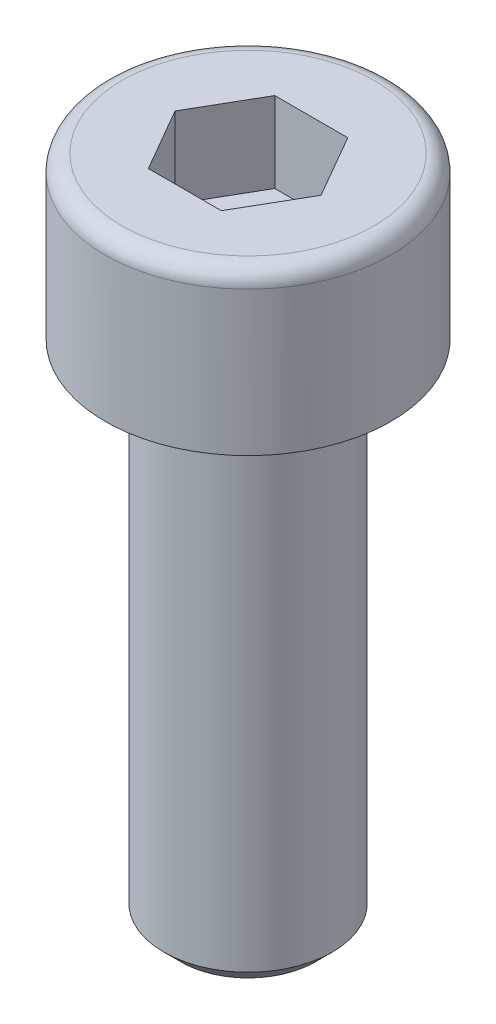
ISO-10303-21;
HEADER;
FILE_DESCRIPTION(('STEP AP214'),'2;1');
FILE_NAME('part.step','',(''),(''),'','','');
FILE_SCHEMA(('AUTOMOTIVE_DESIGN { 1 0 10303 214 1 1 1 1 }'));
ENDSEC;
DATA;
#1=APPLICATION_CONTEXT('core data for automotive mechanical design processes');
#2=APPLICATION_PROTOCOL_DEFINITION('international standard','automotive_design',2000,#1);
#3=PRODUCT_CONTEXT('',#1,'mechanical');
#4=PRODUCT('Part','Part','',(#3));
#5=PRODUCT_RELATED_PRODUCT_CATEGORY('part','',(#4));
#6=PRODUCT_DEFINITION_FORMATION('','',#4);
#7=PRODUCT_DEFINITION_CONTEXT('part definition',#1,'design');
#8=PRODUCT_DEFINITION('design','',#6,#7);
#9=PRODUCT_DEFINITION_SHAPE('','',#8);
#10=(LENGTH_UNIT() NAMED_UNIT(*) SI_UNIT(.MILLI.,.METRE.));
#11=(NAMED_UNIT(*) PLANE_ANGLE_UNIT() SI_UNIT($,.RADIAN.));
#12=(NAMED_UNIT(*) SI_UNIT($,.STERADIAN.) SOLID_ANGLE_UNIT());
#13=UNCERTAINTY_MEASURE_WITH_UNIT(LENGTH_MEASURE(1.E-05),#10,'distance_accuracy_value','');
#14=(GEOMETRIC_REPRESENTATION_CONTEXT(3) GLOBAL_UNCERTAINTY_ASSIGNED_CONTEXT((#13)) GLOBAL_UNIT_ASSIGNED_CONTEXT((#10,
#11,#12)) REPRESENTATION_CONTEXT('',''));
#15=CARTESIAN_POINT('',(0.,0.,0.));
#16=DIRECTION('',(0.,0.,1.));
#17=DIRECTION('',(1.,0.,0.));
#18=AXIS2_PLACEMENT_3D('',#15,#16,#17);
#19=CARTESIAN_POINT('',(2.,-12.,0.));
#20=DIRECTION('',(0.,-1.,0.));
#21=DIRECTION('',(0.,0.,-1.));
#22=AXIS2_PLACEMENT_3D('',#19,#20,#21);
#23=PLANE('',#22);
#24=CARTESIAN_POINT('',(0.,-12.,0.));
#25=DIRECTION('',(0.,-1.,0.));
#26=DIRECTION('',(0.,0.,-1.));
#27=AXIS2_PLACEMENT_3D('',#24,#25,#26);
#28=CIRCLE('',#27,1.6);
#29=CARTESIAN_POINT('',(0.,-12.,-1.6));
#30=VERTEX_POINT('',#29);
#31=EDGE_CURVE('E148',#30,#30,#28,.T.);
#32=ORIENTED_EDGE('',*,*,#31,.T.);
#33=EDGE_LOOP('',(#32));
#34=FACE_BOUND('',#33,.T.);
#35=ADVANCED_FACE('F35',(#34),#23,.T.);
#36=CARTESIAN_POINT('',(0.,3.82,0.));
#37=DIRECTION('',(0.,1.,0.));
#38=DIRECTION('',(0.,0.,1.));
#39=AXIS2_PLACEMENT_3D('',#36,#37,#38);
#40=PLANE('',#39);
#41=DIRECTION('',(1.,0.,0.));
#42=VECTOR('',#41,1.);
#43=CARTESIAN_POINT('',(-0.866025403784438,3.82,1.5));
#44=LINE('',#43,#42);
#45=CARTESIAN_POINT('',(-0.866025403784438,3.82,1.5));
#46=VERTEX_POINT('',#45);
#47=CARTESIAN_POINT('',(0.866025403784439,3.82,1.5));
#48=VERTEX_POINT('',#47);
#49=EDGE_CURVE('E50',#46,#48,#44,.T.);
#50=ORIENTED_EDGE('',*,*,#49,.F.);
#51=DIRECTION('',(0.5,0.,0.866025403784438));
#52=VECTOR('',#51,1.);
#53=CARTESIAN_POINT('',(-1.73205080756888,3.82,0.));
#54=LINE('',#53,#52);
#55=CARTESIAN_POINT('',(-1.73205080756888,3.82,0.));
#56=VERTEX_POINT('',#55);
#57=EDGE_CURVE('E133',#56,#46,#54,.T.);
#58=ORIENTED_EDGE('',*,*,#57,.F.);
#59=DIRECTION('',(-0.5,0.,0.866025403784439));
#60=VECTOR('',#59,1.);
#61=CARTESIAN_POINT('',(-0.866025403784439,3.82,-1.5));
#62=LINE('',#61,#60);
#63=CARTESIAN_POINT('',(-0.866025403784439,3.82,-1.5));
#64=VERTEX_POINT('',#63);
#65=EDGE_CURVE('E131',#64,#56,#62,.T.);
#66=ORIENTED_EDGE('',*,*,#65,.F.);
#67=DIRECTION('',(-1.,0.,0.));
#68=VECTOR('',#67,1.);
#69=CARTESIAN_POINT('',(0.866025403784438,3.82,-1.5));
#70=LINE('',#69,#68);
#71=CARTESIAN_POINT('',(0.866025403784438,3.82,-1.5));
#72=VERTEX_POINT('',#71);
#73=EDGE_CURVE('E98',#72,#64,#70,.T.);
#74=ORIENTED_EDGE('',*,*,#73,.F.);
#75=DIRECTION('',(-0.5,0.,-0.866025403784438));
#76=VECTOR('',#75,1.);
#77=CARTESIAN_POINT('',(1.73205080756888,3.82,0.));
#78=LINE('',#77,#76);
#79=CARTESIAN_POINT('',(1.73205080756888,3.82,0.));
#80=VERTEX_POINT('',#79);
#81=EDGE_CURVE('E127',#80,#72,#78,.T.);
#82=ORIENTED_EDGE('',*,*,#81,.F.);
#83=DIRECTION('',(0.5,0.,-0.866025403784438));
#84=VECTOR('',#83,1.);
#85=CARTESIAN_POINT('',(0.866025403784438,3.82,1.5));
#86=LINE('',#85,#84);
#87=EDGE_CURVE('E124',#48,#80,#86,.T.);
#88=ORIENTED_EDGE('',*,*,#87,.F.);
#89=EDGE_LOOP('',(#50,#58,#66,#74,#82,#88));
#90=FACE_BOUND('',#89,.T.);
#91=CARTESIAN_POINT('',(0.,3.82,0.));
#92=DIRECTION('',(0.,1.,0.));
#93=DIRECTION('',(0.,0.,1.));
#94=AXIS2_PLACEMENT_3D('',#91,#92,#93);
#95=CIRCLE('',#94,2.99);
#96=CARTESIAN_POINT('',(0.,3.82,2.99));
#97=VERTEX_POINT('',#96);
#98=EDGE_CURVE('E11',#97,#97,#95,.T.);
#99=ORIENTED_EDGE('',*,*,#98,.T.);
#100=EDGE_LOOP('',(#99));
#101=FACE_BOUND('',#100,.T.);
#102=ADVANCED_FACE('F173',(#90,#101),#40,.T.);
#103=CARTESIAN_POINT('',(0.,3.82,0.));
#104=DIRECTION('',(0.,-1.,0.));
#105=DIRECTION('',(0.,0.,-1.));
#106=AXIS2_PLACEMENT_3D('',#103,#104,#105);
#107=CYLINDRICAL_SURFACE('',#106,3.39);
#108=CARTESIAN_POINT('',(0.,3.42,0.));
#109=DIRECTION('',(0.,1.,0.));
#110=DIRECTION('',(0.,0.,1.));
#111=AXIS2_PLACEMENT_3D('',#108,#109,#110);
#112=CIRCLE('',#111,3.39);
#113=CARTESIAN_POINT('',(0.,3.42,3.39));
#114=VERTEX_POINT('',#113);
#115=EDGE_CURVE('E43',#114,#114,#112,.F.);
#116=ORIENTED_EDGE('',*,*,#115,.T.);
#117=EDGE_LOOP('',(#116));
#118=FACE_BOUND('',#117,.T.);
#119=CARTESIAN_POINT('',(0.,0.,0.));
#120=DIRECTION('',(0.,-1.,0.));
#121=DIRECTION('',(0.,0.,-1.));
#122=AXIS2_PLACEMENT_3D('',#119,#120,#121);
#123=CIRCLE('',#122,3.39);
#124=CARTESIAN_POINT('',(0.,0.,-3.39));
#125=VERTEX_POINT('',#124);
#126=EDGE_CURVE('E145',#125,#125,#123,.T.);
#127=ORIENTED_EDGE('',*,*,#126,.F.);
#128=EDGE_LOOP('',(#127));
#129=FACE_BOUND('',#128,.T.);
#130=ADVANCED_FACE('F156',(#118,#129),#107,.T.);
#131=CARTESIAN_POINT('',(3.39,0.,0.));
#132=DIRECTION('',(0.,-1.,0.));
#133=DIRECTION('',(0.,0.,-1.));
#134=AXIS2_PLACEMENT_3D('',#131,#132,#133);
#135=PLANE('',#134);
#136=ORIENTED_EDGE('',*,*,#126,.T.);
#137=EDGE_LOOP('',(#136));
#138=FACE_BOUND('',#137,.T.);
#139=CARTESIAN_POINT('',(0.,0.,0.));
#140=DIRECTION('',(0.,-1.,0.));
#141=DIRECTION('',(0.,0.,-1.));
#142=AXIS2_PLACEMENT_3D('',#139,#140,#141);
#143=CIRCLE('',#142,2.);
#144=CARTESIAN_POINT('',(0.,0.,-2.));
#145=VERTEX_POINT('',#144);
#146=EDGE_CURVE('E137',#145,#145,#143,.T.);
#147=ORIENTED_EDGE('',*,*,#146,.F.);
#148=EDGE_LOOP('',(#147));
#149=FACE_BOUND('',#148,.T.);
#150=ADVANCED_FACE('F184',(#138,#149),#135,.T.);
#151=CARTESIAN_POINT('',(0.,3.82,0.));
#152=DIRECTION('',(0.,-1.,0.));
#153=DIRECTION('',(0.,0.,-1.));
#154=AXIS2_PLACEMENT_3D('',#151,#152,#153);
#155=CYLINDRICAL_SURFACE('',#154,2.);
#156=CARTESIAN_POINT('',(0.,-11.6,0.));
#157=DIRECTION('',(0.,-1.,0.));
#158=DIRECTION('',(0.,0.,-1.));
#159=AXIS2_PLACEMENT_3D('',#156,#157,#158);
#160=CIRCLE('',#159,2.);
#161=CARTESIAN_POINT('',(0.,-11.6,-2.));
#162=VERTEX_POINT('',#161);
#163=EDGE_CURVE('E151',#162,#162,#160,.F.);
#164=ORIENTED_EDGE('',*,*,#163,.T.);
#165=EDGE_LOOP('',(#164));
#166=FACE_BOUND('',#165,.T.);
#167=ORIENTED_EDGE('',*,*,#146,.T.);
#168=EDGE_LOOP('',(#167));
#169=FACE_BOUND('',#168,.T.);
#170=ADVANCED_FACE('F169',(#166,#169),#155,.T.);
#171=CARTESIAN_POINT('',(0.,-12.,0.));
#172=DIRECTION('',(0.,1.,0.));
#173=DIRECTION('',(0.,0.,1.));
#174=AXIS2_PLACEMENT_3D('',#171,#172,#173);
#175=CONICAL_SURFACE('',#174,1.6,0.785398163397445);
#176=ORIENTED_EDGE('',*,*,#163,.F.);
#177=EDGE_LOOP('',(#176));
#178=FACE_BOUND('',#177,.T.);
#179=ORIENTED_EDGE('',*,*,#31,.F.);
#180=EDGE_LOOP('',(#179));
#181=FACE_BOUND('',#180,.T.);
#182=ADVANCED_FACE('F161',(#178,#181),#175,.T.);
#183=CARTESIAN_POINT('',(0.,3.42,0.));
#184=DIRECTION('',(0.,1.,0.));
#185=DIRECTION('',(0.,0.,1.));
#186=AXIS2_PLACEMENT_3D('',#183,#184,#185);
#187=TOROIDAL_SURFACE('',#186,2.99,0.4);
#188=ORIENTED_EDGE('',*,*,#98,.F.);
#189=EDGE_LOOP('',(#188));
#190=FACE_BOUND('',#189,.T.);
#191=ORIENTED_EDGE('',*,*,#115,.F.);
#192=EDGE_LOOP('',(#191));
#193=FACE_BOUND('',#192,.T.);
#194=ADVANCED_FACE('F37',(#190,#193),#187,.T.);
#195=CARTESIAN_POINT('',(-0.866025403784438,1.91,1.5));
#196=DIRECTION('',(0.,0.,1.));
#197=DIRECTION('',(1.,0.,0.));
#198=AXIS2_PLACEMENT_3D('',#195,#196,#197);
#199=PLANE('',#198);
#200=ORIENTED_EDGE('',*,*,#49,.T.);
#201=DIRECTION('',(0.,1.,0.));
#202=VECTOR('',#201,1.);
#203=CARTESIAN_POINT('',(0.866025403784438,1.91,1.5));
#204=LINE('',#203,#202);
#205=CARTESIAN_POINT('',(0.866025403784438,1.91,1.5));
#206=VERTEX_POINT('',#205);
#207=EDGE_CURVE('E80',#206,#48,#204,.T.);
#208=ORIENTED_EDGE('',*,*,#207,.F.);
#209=DIRECTION('',(1.,0.,0.));
#210=VECTOR('',#209,1.);
#211=CARTESIAN_POINT('',(-0.866025403784438,1.91,1.5));
#212=LINE('',#211,#210);
#213=CARTESIAN_POINT('',(-0.866025403784438,1.91,1.5));
#214=VERTEX_POINT('',#213);
#215=EDGE_CURVE('E135',#214,#206,#212,.T.);
#216=ORIENTED_EDGE('',*,*,#215,.F.);
#217=DIRECTION('',(0.,1.,0.));
#218=VECTOR('',#217,1.);
#219=CARTESIAN_POINT('',(-0.866025403784438,1.91,1.5));
#220=LINE('',#219,#218);
#221=EDGE_CURVE('E58',#214,#46,#220,.T.);
#222=ORIENTED_EDGE('',*,*,#221,.T.);
#223=EDGE_LOOP('',(#200,#208,#216,#222));
#224=FACE_BOUND('',#223,.T.);
#225=ADVANCED_FACE('F160',(#224),#199,.F.);
#226=CARTESIAN_POINT('',(-1.73205080756888,1.91,0.));
#227=DIRECTION('',(-0.866025403784438,0.,0.5));
#228=DIRECTION('',(0.5,0.,0.866025403784439));
#229=AXIS2_PLACEMENT_3D('',#226,#227,#228);
#230=PLANE('',#229);
#231=ORIENTED_EDGE('',*,*,#57,.T.);
#232=ORIENTED_EDGE('',*,*,#221,.F.);
#233=DIRECTION('',(0.5,0.,0.866025403784438));
#234=VECTOR('',#233,1.);
#235=CARTESIAN_POINT('',(-1.73205080756888,1.91,0.));
#236=LINE('',#235,#234);
#237=CARTESIAN_POINT('',(-1.73205080756888,1.91,0.));
#238=VERTEX_POINT('',#237);
#239=EDGE_CURVE('E110',#238,#214,#236,.T.);
#240=ORIENTED_EDGE('',*,*,#239,.F.);
#241=DIRECTION('',(0.,1.,0.));
#242=VECTOR('',#241,1.);
#243=CARTESIAN_POINT('',(-1.73205080756888,1.91,0.));
#244=LINE('',#243,#242);
#245=EDGE_CURVE('E102',#238,#56,#244,.T.);
#246=ORIENTED_EDGE('',*,*,#245,.T.);
#247=EDGE_LOOP('',(#231,#232,#240,#246));
#248=FACE_BOUND('',#247,.T.);
#249=ADVANCED_FACE('F167',(#248),#230,.F.);
#250=CARTESIAN_POINT('',(-0.866025403784439,1.91,-1.5));
#251=DIRECTION('',(-0.866025403784439,0.,-0.5));
#252=DIRECTION('',(-0.5,0.,0.866025403784439));
#253=AXIS2_PLACEMENT_3D('',#250,#251,#252);
#254=PLANE('',#253);
#255=ORIENTED_EDGE('',*,*,#65,.T.);
#256=ORIENTED_EDGE('',*,*,#245,.F.);
#257=DIRECTION('',(-0.5,0.,0.866025403784439));
#258=VECTOR('',#257,1.);
#259=CARTESIAN_POINT('',(-0.866025403784439,1.91,-1.5));
#260=LINE('',#259,#258);
#261=CARTESIAN_POINT('',(-0.866025403784439,1.91,-1.5));
#262=VERTEX_POINT('',#261);
#263=EDGE_CURVE('E106',#262,#238,#260,.T.);
#264=ORIENTED_EDGE('',*,*,#263,.F.);
#265=DIRECTION('',(0.,1.,0.));
#266=VECTOR('',#265,1.);
#267=CARTESIAN_POINT('',(-0.866025403784439,1.91,-1.5));
#268=LINE('',#267,#266);
#269=EDGE_CURVE('E91',#262,#64,#268,.T.);
#270=ORIENTED_EDGE('',*,*,#269,.T.);
#271=EDGE_LOOP('',(#255,#256,#264,#270));
#272=FACE_BOUND('',#271,.T.);
#273=ADVANCED_FACE('F107',(#272),#254,.F.);
#274=CARTESIAN_POINT('',(0.866025403784438,1.91,-1.5));
#275=DIRECTION('',(0.,0.,-1.));
#276=DIRECTION('',(-1.,0.,0.));
#277=AXIS2_PLACEMENT_3D('',#274,#275,#276);
#278=PLANE('',#277);
#279=ORIENTED_EDGE('',*,*,#73,.T.);
#280=ORIENTED_EDGE('',*,*,#269,.F.);
#281=DIRECTION('',(-1.,0.,0.));
#282=VECTOR('',#281,1.);
#283=CARTESIAN_POINT('',(0.866025403784438,1.91,-1.5));
#284=LINE('',#283,#282);
#285=CARTESIAN_POINT('',(0.866025403784438,1.91,-1.5));
#286=VERTEX_POINT('',#285);
#287=EDGE_CURVE('E95',#286,#262,#284,.T.);
#288=ORIENTED_EDGE('',*,*,#287,.F.);
#289=DIRECTION('',(0.,1.,0.));
#290=VECTOR('',#289,1.);
#291=CARTESIAN_POINT('',(0.866025403784438,1.91,-1.5));
#292=LINE('',#291,#290);
#293=EDGE_CURVE('E103',#286,#72,#292,.T.);
#294=ORIENTED_EDGE('',*,*,#293,.T.);
#295=EDGE_LOOP('',(#279,#280,#288,#294));
#296=FACE_BOUND('',#295,.T.);
#297=ADVANCED_FACE('F93',(#296),#278,.F.);
#298=CARTESIAN_POINT('',(1.73205080756888,1.91,0.));
#299=DIRECTION('',(0.866025403784438,0.,-0.5));
#300=DIRECTION('',(-0.5,0.,-0.866025403784438));
#301=AXIS2_PLACEMENT_3D('',#298,#299,#300);
#302=PLANE('',#301);
#303=ORIENTED_EDGE('',*,*,#81,.T.);
#304=ORIENTED_EDGE('',*,*,#293,.F.);
#305=DIRECTION('',(-0.5,0.,-0.866025403784438));
#306=VECTOR('',#305,1.);
#307=CARTESIAN_POINT('',(1.73205080756888,1.91,0.));
#308=LINE('',#307,#306);
#309=CARTESIAN_POINT('',(1.73205080756888,1.91,0.));
#310=VERTEX_POINT('',#309);
#311=EDGE_CURVE('E116',#310,#286,#308,.T.);
#312=ORIENTED_EDGE('',*,*,#311,.F.);
#313=DIRECTION('',(0.,1.,0.));
#314=VECTOR('',#313,1.);
#315=CARTESIAN_POINT('',(1.73205080756888,1.91,0.));
#316=LINE('',#315,#314);
#317=EDGE_CURVE('E140',#310,#80,#316,.T.);
#318=ORIENTED_EDGE('',*,*,#317,.T.);
#319=EDGE_LOOP('',(#303,#304,#312,#318));
#320=FACE_BOUND('',#319,.T.);
#321=ADVANCED_FACE('F194',(#320),#302,.F.);
#322=CARTESIAN_POINT('',(0.866025403784438,1.91,1.5));
#323=DIRECTION('',(0.866025403784439,0.,0.5));
#324=DIRECTION('',(0.5,0.,-0.866025403784439));
#325=AXIS2_PLACEMENT_3D('',#322,#323,#324);
#326=PLANE('',#325);
#327=ORIENTED_EDGE('',*,*,#87,.T.);
#328=ORIENTED_EDGE('',*,*,#317,.F.);
#329=DIRECTION('',(0.5,0.,-0.866025403784438));
#330=VECTOR('',#329,1.);
#331=CARTESIAN_POINT('',(0.866025403784438,1.91,1.5));
#332=LINE('',#331,#330);
#333=EDGE_CURVE('E118',#206,#310,#332,.T.);
#334=ORIENTED_EDGE('',*,*,#333,.F.);
#335=ORIENTED_EDGE('',*,*,#207,.T.);
#336=EDGE_LOOP('',(#327,#328,#334,#335));
#337=FACE_BOUND('',#336,.T.);
#338=ADVANCED_FACE('F191',(#337),#326,.F.);
#339=CARTESIAN_POINT('',(0.,1.91,0.));
#340=DIRECTION('',(0.,1.,0.));
#341=DIRECTION('',(0.,0.,1.));
#342=AXIS2_PLACEMENT_3D('',#339,#340,#341);
#343=PLANE('',#342);
#344=ORIENTED_EDGE('',*,*,#215,.T.);
#345=ORIENTED_EDGE('',*,*,#333,.T.);
#346=ORIENTED_EDGE('',*,*,#311,.T.);
#347=ORIENTED_EDGE('',*,*,#287,.T.);
#348=ORIENTED_EDGE('',*,*,#263,.T.);
#349=ORIENTED_EDGE('',*,*,#239,.T.);
#350=EDGE_LOOP('',(#344,#345,#346,#347,#348,#349));
#351=FACE_BOUND('',#350,.T.);
#352=ADVANCED_FACE('F113',(#351),#343,.T.);
#353=CLOSED_SHELL('',(#35,#102,#130,#150,#170,#182,#194,#225,#249,#273,#297,#321,#338,#352));
#354=MANIFOLD_SOLID_BREP('B2',#353);
#355=ADVANCED_BREP_SHAPE_REPRESENTATION('',(#18,#354),#14);
#356=SHAPE_DEFINITION_REPRESENTATION(#9,#355);
ENDSEC;
END-ISO-10303-21;
